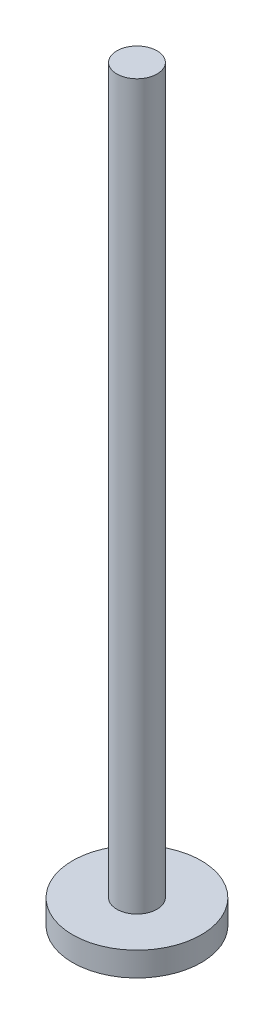
ISO-10303-21;
HEADER;
FILE_DESCRIPTION(('STEP AP214'),'2;1');
FILE_NAME('part.step','',(''),(''),'','','');
FILE_SCHEMA(('AUTOMOTIVE_DESIGN { 1 0 10303 214 1 1 1 1 }'));
ENDSEC;
DATA;
#1=APPLICATION_CONTEXT('core data for automotive mechanical design processes');
#2=APPLICATION_PROTOCOL_DEFINITION('international standard','automotive_design',2000,#1);
#3=PRODUCT_CONTEXT('',#1,'mechanical');
#4=PRODUCT('Part','Part','',(#3));
#5=PRODUCT_RELATED_PRODUCT_CATEGORY('part','',(#4));
#6=PRODUCT_DEFINITION_FORMATION('','',#4);
#7=PRODUCT_DEFINITION_CONTEXT('part definition',#1,'design');
#8=PRODUCT_DEFINITION('design','',#6,#7);
#9=PRODUCT_DEFINITION_SHAPE('','',#8);
#10=(LENGTH_UNIT() NAMED_UNIT(*) SI_UNIT(.MILLI.,.METRE.));
#11=(NAMED_UNIT(*) PLANE_ANGLE_UNIT() SI_UNIT($,.RADIAN.));
#12=(NAMED_UNIT(*) SI_UNIT($,.STERADIAN.) SOLID_ANGLE_UNIT());
#13=UNCERTAINTY_MEASURE_WITH_UNIT(LENGTH_MEASURE(1.E-05),#10,'distance_accuracy_value','');
#14=(GEOMETRIC_REPRESENTATION_CONTEXT(3) GLOBAL_UNCERTAINTY_ASSIGNED_CONTEXT((#13)) GLOBAL_UNIT_ASSIGNED_CONTEXT((#10,
#11,#12)) REPRESENTATION_CONTEXT('',''));
#15=CARTESIAN_POINT('',(0.,0.,0.));
#16=DIRECTION('',(0.,0.,1.));
#17=DIRECTION('',(1.,0.,0.));
#18=AXIS2_PLACEMENT_3D('',#15,#16,#17);
#19=CARTESIAN_POINT('',(0.,3.,0.));
#20=DIRECTION('',(0.,-1.,0.));
#21=DIRECTION('',(0.,0.,-1.));
#22=AXIS2_PLACEMENT_3D('',#19,#20,#21);
#23=CYLINDRICAL_SURFACE('',#22,8.);
#24=CARTESIAN_POINT('',(0.,3.,0.));
#25=DIRECTION('',(0.,1.,0.));
#26=DIRECTION('',(0.,0.,1.));
#27=AXIS2_PLACEMENT_3D('',#24,#25,#26);
#28=CIRCLE('',#27,8.);
#29=CARTESIAN_POINT('',(0.,3.,8.));
#30=VERTEX_POINT('',#29);
#31=EDGE_CURVE('E10',#30,#30,#28,.T.);
#32=ORIENTED_EDGE('',*,*,#31,.F.);
#33=EDGE_LOOP('',(#32));
#34=FACE_BOUND('',#33,.T.);
#35=CARTESIAN_POINT('',(0.,0.,0.));
#36=DIRECTION('',(0.,1.,0.));
#37=DIRECTION('',(0.,0.,1.));
#38=AXIS2_PLACEMENT_3D('',#35,#36,#37);
#39=CIRCLE('',#38,8.);
#40=CARTESIAN_POINT('',(0.,0.,8.));
#41=VERTEX_POINT('',#40);
#42=EDGE_CURVE('E36',#41,#41,#39,.T.);
#43=ORIENTED_EDGE('',*,*,#42,.T.);
#44=EDGE_LOOP('',(#43));
#45=FACE_BOUND('',#44,.T.);
#46=ADVANCED_FACE('F33',(#34,#45),#23,.T.);
#47=CARTESIAN_POINT('',(0.,3.,0.));
#48=DIRECTION('',(0.,1.,0.));
#49=DIRECTION('',(0.,0.,1.));
#50=AXIS2_PLACEMENT_3D('',#47,#48,#49);
#51=PLANE('',#50);
#52=CARTESIAN_POINT('',(0.,3.,0.));
#53=DIRECTION('',(0.,1.,0.));
#54=DIRECTION('',(0.,0.,1.));
#55=AXIS2_PLACEMENT_3D('',#52,#53,#54);
#56=CIRCLE('',#55,2.5);
#57=CARTESIAN_POINT('',(0.,2.99999999999999,-2.5));
#58=VERTEX_POINT('',#57);
#59=EDGE_CURVE('E45',#58,#58,#56,.T.);
#60=ORIENTED_EDGE('',*,*,#59,.F.);
#61=EDGE_LOOP('',(#60));
#62=FACE_BOUND('',#61,.T.);
#63=ORIENTED_EDGE('',*,*,#31,.T.);
#64=EDGE_LOOP('',(#63));
#65=FACE_BOUND('',#64,.T.);
#66=ADVANCED_FACE('F60',(#62,#65),#51,.T.);
#67=CARTESIAN_POINT('',(0.,0.,0.));
#68=DIRECTION('',(0.,1.,0.));
#69=DIRECTION('',(0.,0.,1.));
#70=AXIS2_PLACEMENT_3D('',#67,#68,#69);
#71=PLANE('',#70);
#72=ORIENTED_EDGE('',*,*,#42,.F.);
#73=EDGE_LOOP('',(#72));
#74=FACE_BOUND('',#73,.T.);
#75=ADVANCED_FACE('F56',(#74),#71,.F.);
#76=CARTESIAN_POINT('',(0.,93.,0.));
#77=DIRECTION('',(0.,-1.,0.));
#78=DIRECTION('',(0.,0.,-1.));
#79=AXIS2_PLACEMENT_3D('',#76,#77,#78);
#80=CYLINDRICAL_SURFACE('',#79,2.5);
#81=CARTESIAN_POINT('',(0.,93.,0.));
#82=DIRECTION('',(0.,1.,0.));
#83=DIRECTION('',(0.,0.,1.));
#84=AXIS2_PLACEMENT_3D('',#81,#82,#83);
#85=CIRCLE('',#84,2.5);
#86=CARTESIAN_POINT('',(0.,93.,-2.5));
#87=VERTEX_POINT('',#86);
#88=EDGE_CURVE('E43',#87,#87,#85,.T.);
#89=CARTESIAN_POINT('',(0.,93.,-2.5));
#90=CARTESIAN_POINT('',(0.,92.0625,-2.5));
#91=CARTESIAN_POINT('',(0.,91.125,-2.5));
#92=CARTESIAN_POINT('',(0.,89.25,-2.5));
#93=CARTESIAN_POINT('',(0.,88.3125,-2.5));
#94=CARTESIAN_POINT('',(0.,86.4375,-2.5));
#95=CARTESIAN_POINT('',(0.,85.5,-2.5));
#96=CARTESIAN_POINT('',(0.,83.625,-2.5));
#97=CARTESIAN_POINT('',(0.,82.6875,-2.5));
#98=CARTESIAN_POINT('',(0.,80.8125,-2.5));
#99=CARTESIAN_POINT('',(0.,79.875,-2.5));
#100=CARTESIAN_POINT('',(0.,78.,-2.5));
#101=CARTESIAN_POINT('',(0.,77.0625,-2.5));
#102=CARTESIAN_POINT('',(0.,75.1875,-2.5));
#103=CARTESIAN_POINT('',(0.,74.25,-2.5));
#104=CARTESIAN_POINT('',(0.,72.375,-2.5));
#105=CARTESIAN_POINT('',(0.,71.4375,-2.5));
#106=CARTESIAN_POINT('',(0.,69.5625,-2.5));
#107=CARTESIAN_POINT('',(0.,68.625,-2.5));
#108=CARTESIAN_POINT('',(0.,66.75,-2.5));
#109=CARTESIAN_POINT('',(0.,65.8125,-2.5));
#110=CARTESIAN_POINT('',(0.,63.9375,-2.5));
#111=CARTESIAN_POINT('',(0.,63.,-2.5));
#112=CARTESIAN_POINT('',(0.,61.125,-2.5));
#113=CARTESIAN_POINT('',(0.,60.1875,-2.5));
#114=CARTESIAN_POINT('',(0.,58.3125,-2.5));
#115=CARTESIAN_POINT('',(0.,57.375,-2.5));
#116=CARTESIAN_POINT('',(0.,55.5,-2.5));
#117=CARTESIAN_POINT('',(0.,54.5625,-2.5));
#118=CARTESIAN_POINT('',(0.,52.6875,-2.5));
#119=CARTESIAN_POINT('',(0.,51.75,-2.5));
#120=CARTESIAN_POINT('',(0.,49.875,-2.5));
#121=CARTESIAN_POINT('',(0.,48.9375,-2.5));
#122=CARTESIAN_POINT('',(0.,47.0625,-2.5));
#123=CARTESIAN_POINT('',(0.,46.125,-2.5));
#124=CARTESIAN_POINT('',(0.,44.25,-2.5));
#125=CARTESIAN_POINT('',(0.,43.3125,-2.5));
#126=CARTESIAN_POINT('',(0.,41.4375,-2.5));
#127=CARTESIAN_POINT('',(0.,40.5,-2.5));
#128=CARTESIAN_POINT('',(0.,38.625,-2.5));
#129=CARTESIAN_POINT('',(0.,37.6875,-2.5));
#130=CARTESIAN_POINT('',(0.,35.8125,-2.5));
#131=CARTESIAN_POINT('',(0.,34.875,-2.5));
#132=CARTESIAN_POINT('',(0.,33.,-2.5));
#133=CARTESIAN_POINT('',(0.,32.0625,-2.5));
#134=CARTESIAN_POINT('',(0.,30.1875,-2.5));
#135=CARTESIAN_POINT('',(0.,29.25,-2.5));
#136=CARTESIAN_POINT('',(0.,27.375,-2.5));
#137=CARTESIAN_POINT('',(0.,26.4375,-2.5));
#138=CARTESIAN_POINT('',(0.,24.5625,-2.5));
#139=CARTESIAN_POINT('',(0.,23.625,-2.5));
#140=CARTESIAN_POINT('',(0.,21.75,-2.5));
#141=CARTESIAN_POINT('',(0.,20.8125,-2.5));
#142=CARTESIAN_POINT('',(0.,18.9375,-2.5));
#143=CARTESIAN_POINT('',(0.,18.,-2.5));
#144=CARTESIAN_POINT('',(0.,16.125,-2.5));
#145=CARTESIAN_POINT('',(0.,15.1875,-2.5));
#146=CARTESIAN_POINT('',(0.,13.3125,-2.5));
#147=CARTESIAN_POINT('',(0.,12.375,-2.5));
#148=CARTESIAN_POINT('',(0.,10.5,-2.5));
#149=CARTESIAN_POINT('',(0.,9.56249999999999,-2.5));
#150=CARTESIAN_POINT('',(0.,7.68749999999999,-2.5));
#151=CARTESIAN_POINT('',(0.,6.74999999999999,-2.5));
#152=CARTESIAN_POINT('',(0.,4.87499999999999,-2.5));
#153=CARTESIAN_POINT('',(0.,3.93749999999999,-2.5));
#154=CARTESIAN_POINT('',(0.,2.99999999999999,-2.5));
#155=B_SPLINE_CURVE_WITH_KNOTS('',3,(#89,#90,#91,#92,#93,#94,#95,#96,#97,#98,#99,#100,#101,#102,
#103,#104,#105,#106,#107,#108,#109,#110,#111,#112,#113,#114,#115,#116,#117,#118,#119,#120,#121,
#122,#123,#124,#125,#126,#127,#128,#129,#130,#131,#132,#133,#134,#135,#136,#137,#138,#139,#140,
#141,#142,#143,#144,#145,#146,#147,#148,#149,#150,#151,#152,#153,#154),.UNSPECIFIED.,.F.,.F.,(4,
2,2,2,2,2,2,2,2,2,2,2,2,2,2,2,2,2,2,2,2,2,2,2,2,2,2,2,2,2,2,2,4),(0.,2.81250000000001,
5.62500000000001,8.43750000000001,11.25,14.0625,16.875,19.6875,22.5,25.3125,28.125,30.9375,
33.75,36.5625,39.375,42.1875,45.,47.8125,50.625,53.4375,56.25,59.0625,61.875,64.6875,67.5,
70.3125,73.125,75.9375,78.75,81.5625,84.375,87.1875,90.),.UNSPECIFIED.);
#156=EDGE_CURVE('BSEAM53',#87,#58,#155,.T.);
#157=ORIENTED_EDGE('',*,*,#88,.F.);
#158=ORIENTED_EDGE('',*,*,#59,.T.);
#159=ORIENTED_EDGE('',*,*,#156,.T.);
#160=ORIENTED_EDGE('',*,*,#156,.F.);
#161=EDGE_LOOP('',(#157,#159,#158,#160));
#162=FACE_BOUND('',#161,.T.);
#163=ADVANCED_FACE('F53',(#162),#80,.T.);
#164=CARTESIAN_POINT('',(0.,93.,0.));
#165=DIRECTION('',(0.,1.,0.));
#166=DIRECTION('',(0.,0.,1.));
#167=AXIS2_PLACEMENT_3D('',#164,#165,#166);
#168=PLANE('',#167);
#169=ORIENTED_EDGE('',*,*,#88,.T.);
#170=EDGE_LOOP('',(#169));
#171=FACE_BOUND('',#170,.T.);
#172=ADVANCED_FACE('F51',(#171),#168,.T.);
#173=CLOSED_SHELL('',(#46,#66,#75,#163,#172));
#174=MANIFOLD_SOLID_BREP('B2',#173);
#175=ADVANCED_BREP_SHAPE_REPRESENTATION('',(#18,#174),#14);
#176=SHAPE_DEFINITION_REPRESENTATION(#9,#175);
ENDSEC;
END-ISO-10303-21;
